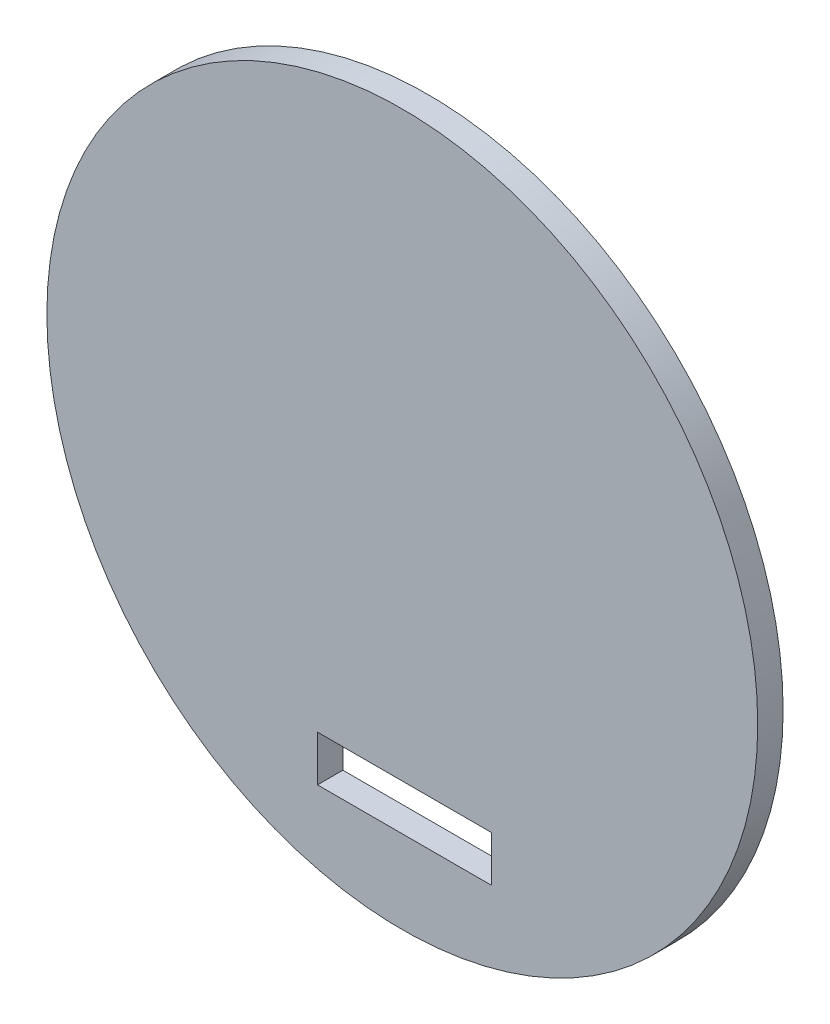
ISO-10303-21;
HEADER;
FILE_DESCRIPTION(('STEP AP214'),'2;1');
FILE_NAME('part.step','',(''),(''),'','','');
FILE_SCHEMA(('AUTOMOTIVE_DESIGN { 1 0 10303 214 1 1 1 1 }'));
ENDSEC;
DATA;
#1=APPLICATION_CONTEXT('core data for automotive mechanical design processes');
#2=APPLICATION_PROTOCOL_DEFINITION('international standard','automotive_design',2000,#1);
#3=PRODUCT_CONTEXT('',#1,'mechanical');
#4=PRODUCT('Part','Part','',(#3));
#5=PRODUCT_RELATED_PRODUCT_CATEGORY('part','',(#4));
#6=PRODUCT_DEFINITION_FORMATION('','',#4);
#7=PRODUCT_DEFINITION_CONTEXT('part definition',#1,'design');
#8=PRODUCT_DEFINITION('design','',#6,#7);
#9=PRODUCT_DEFINITION_SHAPE('','',#8);
#10=(LENGTH_UNIT() NAMED_UNIT(*) SI_UNIT(.MILLI.,.METRE.));
#11=(NAMED_UNIT(*) PLANE_ANGLE_UNIT() SI_UNIT($,.RADIAN.));
#12=(NAMED_UNIT(*) SI_UNIT($,.STERADIAN.) SOLID_ANGLE_UNIT());
#13=UNCERTAINTY_MEASURE_WITH_UNIT(LENGTH_MEASURE(1.E-05),#10,'distance_accuracy_value','');
#14=(GEOMETRIC_REPRESENTATION_CONTEXT(3) GLOBAL_UNCERTAINTY_ASSIGNED_CONTEXT((#13)) GLOBAL_UNIT_ASSIGNED_CONTEXT((#10,
#11,#12)) REPRESENTATION_CONTEXT('',''));
#15=CARTESIAN_POINT('',(0.,0.,0.));
#16=DIRECTION('',(0.,0.,1.));
#17=DIRECTION('',(1.,0.,0.));
#18=AXIS2_PLACEMENT_3D('',#15,#16,#17);
#19=CARTESIAN_POINT('',(0.,0.,1.));
#20=DIRECTION('',(0.,0.,1.));
#21=DIRECTION('',(1.,0.,0.));
#22=AXIS2_PLACEMENT_3D('',#19,#20,#21);
#23=PLANE('',#22);
#24=CARTESIAN_POINT('',(0.,0.,1.));
#25=DIRECTION('',(0.,0.,1.));
#26=DIRECTION('',(1.,0.,0.));
#27=AXIS2_PLACEMENT_3D('',#24,#25,#26);
#28=CIRCLE('',#27,14.);
#29=CARTESIAN_POINT('',(14.,0.,1.));
#30=VERTEX_POINT('',#29);
#31=EDGE_CURVE('E12',#30,#30,#28,.T.);
#32=ORIENTED_EDGE('',*,*,#31,.T.);
#33=EDGE_LOOP('',(#32));
#34=FACE_BOUND('',#33,.T.);
#35=DIRECTION('',(0.,-1.,0.));
#36=VECTOR('',#35,1.);
#37=CARTESIAN_POINT('',(3.50928581850868,-8.92789217330552,1.));
#38=LINE('',#37,#36);
#39=CARTESIAN_POINT('',(3.50928581850868,-8.92789217330552,1.));
#40=VERTEX_POINT('',#39);
#41=CARTESIAN_POINT('',(3.50928581850868,-10.7278921733055,1.));
#42=VERTEX_POINT('',#41);
#43=EDGE_CURVE('E97',#40,#42,#38,.T.);
#44=ORIENTED_EDGE('',*,*,#43,.T.);
#45=DIRECTION('',(1.,0.,0.));
#46=VECTOR('',#45,1.);
#47=CARTESIAN_POINT('',(-3.34071418149132,-10.7278921733055,1.));
#48=LINE('',#47,#46);
#49=CARTESIAN_POINT('',(-3.34071418149132,-10.7278921733055,1.));
#50=VERTEX_POINT('',#49);
#51=EDGE_CURVE('E88',#50,#42,#48,.T.);
#52=ORIENTED_EDGE('',*,*,#51,.F.);
#53=DIRECTION('',(0.,-1.,0.));
#54=VECTOR('',#53,1.);
#55=CARTESIAN_POINT('',(-3.34071418149132,-8.92789217330552,1.));
#56=LINE('',#55,#54);
#57=CARTESIAN_POINT('',(-3.34071418149132,-8.92789217330552,1.));
#58=VERTEX_POINT('',#57);
#59=EDGE_CURVE('E108',#58,#50,#56,.T.);
#60=ORIENTED_EDGE('',*,*,#59,.F.);
#61=DIRECTION('',(1.,0.,0.));
#62=VECTOR('',#61,1.);
#63=CARTESIAN_POINT('',(-3.34071418149132,-8.92789217330552,1.));
#64=LINE('',#63,#62);
#65=EDGE_CURVE('E63',#58,#40,#64,.T.);
#66=ORIENTED_EDGE('',*,*,#65,.T.);
#67=EDGE_LOOP('',(#44,#52,#60,#66));
#68=FACE_BOUND('',#67,.T.);
#69=ADVANCED_FACE('F48',(#34,#68),#23,.T.);
#70=CARTESIAN_POINT('',(0.,0.,0.));
#71=DIRECTION('',(0.,0.,1.));
#72=DIRECTION('',(1.,0.,0.));
#73=AXIS2_PLACEMENT_3D('',#70,#71,#72);
#74=PLANE('',#73);
#75=CARTESIAN_POINT('',(0.,0.,0.));
#76=DIRECTION('',(0.,0.,1.));
#77=DIRECTION('',(1.,0.,0.));
#78=AXIS2_PLACEMENT_3D('',#75,#76,#77);
#79=CIRCLE('',#78,14.);
#80=CARTESIAN_POINT('',(14.,0.,0.));
#81=VERTEX_POINT('',#80);
#82=EDGE_CURVE('E52',#81,#81,#79,.T.);
#83=ORIENTED_EDGE('',*,*,#82,.F.);
#84=EDGE_LOOP('',(#83));
#85=FACE_BOUND('',#84,.T.);
#86=DIRECTION('',(1.,0.,0.));
#87=VECTOR('',#86,1.);
#88=CARTESIAN_POINT('',(-3.34071418149132,-10.7278921733055,0.));
#89=LINE('',#88,#87);
#90=CARTESIAN_POINT('',(-3.34071418149132,-10.7278921733055,0.));
#91=VERTEX_POINT('',#90);
#92=CARTESIAN_POINT('',(3.50928581850868,-10.7278921733055,0.));
#93=VERTEX_POINT('',#92);
#94=EDGE_CURVE('E71',#91,#93,#89,.T.);
#95=ORIENTED_EDGE('',*,*,#94,.T.);
#96=DIRECTION('',(0.,-1.,0.));
#97=VECTOR('',#96,1.);
#98=CARTESIAN_POINT('',(3.50928581850868,-8.92789217330552,0.));
#99=LINE('',#98,#97);
#100=CARTESIAN_POINT('',(3.50928581850868,-8.92789217330552,0.));
#101=VERTEX_POINT('',#100);
#102=EDGE_CURVE('E104',#101,#93,#99,.T.);
#103=ORIENTED_EDGE('',*,*,#102,.F.);
#104=DIRECTION('',(1.,0.,0.));
#105=VECTOR('',#104,1.);
#106=CARTESIAN_POINT('',(-3.34071418149132,-8.92789217330552,0.));
#107=LINE('',#106,#105);
#108=CARTESIAN_POINT('',(-3.34071418149132,-8.92789217330552,0.));
#109=VERTEX_POINT('',#108);
#110=EDGE_CURVE('E114',#109,#101,#107,.T.);
#111=ORIENTED_EDGE('',*,*,#110,.F.);
#112=DIRECTION('',(0.,-1.,0.));
#113=VECTOR('',#112,1.);
#114=CARTESIAN_POINT('',(-3.34071418149132,-8.92789217330552,0.));
#115=LINE('',#114,#113);
#116=EDGE_CURVE('E98',#109,#91,#115,.T.);
#117=ORIENTED_EDGE('',*,*,#116,.T.);
#118=EDGE_LOOP('',(#95,#103,#111,#117));
#119=FACE_BOUND('',#118,.T.);
#120=ADVANCED_FACE('F126',(#85,#119),#74,.F.);
#121=CARTESIAN_POINT('',(0.,0.,1.));
#122=DIRECTION('',(0.,0.,-1.));
#123=DIRECTION('',(-1.,0.,0.));
#124=AXIS2_PLACEMENT_3D('',#121,#122,#123);
#125=CYLINDRICAL_SURFACE('',#124,14.);
#126=ORIENTED_EDGE('',*,*,#31,.F.);
#127=EDGE_LOOP('',(#126));
#128=FACE_BOUND('',#127,.T.);
#129=ORIENTED_EDGE('',*,*,#82,.T.);
#130=EDGE_LOOP('',(#129));
#131=FACE_BOUND('',#130,.T.);
#132=ADVANCED_FACE('F50',(#128,#131),#125,.T.);
#133=CARTESIAN_POINT('',(-3.34071418149132,-10.7278921733055,1.));
#134=DIRECTION('',(0.,1.,0.));
#135=DIRECTION('',(0.,0.,1.));
#136=AXIS2_PLACEMENT_3D('',#133,#134,#135);
#137=PLANE('',#136);
#138=ORIENTED_EDGE('',*,*,#94,.F.);
#139=DIRECTION('',(0.,0.,-1.));
#140=VECTOR('',#139,1.);
#141=CARTESIAN_POINT('',(-3.34071418149132,-10.7278921733055,1.));
#142=LINE('',#141,#140);
#143=EDGE_CURVE('E93',#50,#91,#142,.T.);
#144=ORIENTED_EDGE('',*,*,#143,.F.);
#145=ORIENTED_EDGE('',*,*,#51,.T.);
#146=DIRECTION('',(0.,0.,-1.));
#147=VECTOR('',#146,1.);
#148=CARTESIAN_POINT('',(3.50928581850868,-10.7278921733055,1.));
#149=LINE('',#148,#147);
#150=EDGE_CURVE('E91',#42,#93,#149,.T.);
#151=ORIENTED_EDGE('',*,*,#150,.T.);
#152=EDGE_LOOP('',(#138,#144,#145,#151));
#153=FACE_BOUND('',#152,.T.);
#154=ADVANCED_FACE('F90',(#153),#137,.T.);
#155=CARTESIAN_POINT('',(3.50928581850868,-8.92789217330552,1.));
#156=DIRECTION('',(1.,0.,0.));
#157=DIRECTION('',(0.,1.,0.));
#158=AXIS2_PLACEMENT_3D('',#155,#156,#157);
#159=PLANE('',#158);
#160=ORIENTED_EDGE('',*,*,#102,.T.);
#161=ORIENTED_EDGE('',*,*,#150,.F.);
#162=ORIENTED_EDGE('',*,*,#43,.F.);
#163=DIRECTION('',(0.,0.,-1.));
#164=VECTOR('',#163,1.);
#165=CARTESIAN_POINT('',(3.50928581850868,-8.92789217330552,1.));
#166=LINE('',#165,#164);
#167=EDGE_CURVE('E105',#40,#101,#166,.T.);
#168=ORIENTED_EDGE('',*,*,#167,.T.);
#169=EDGE_LOOP('',(#160,#161,#162,#168));
#170=FACE_BOUND('',#169,.T.);
#171=ADVANCED_FACE('F102',(#170),#159,.F.);
#172=CARTESIAN_POINT('',(-3.34071418149132,-8.92789217330552,1.));
#173=DIRECTION('',(0.,1.,0.));
#174=DIRECTION('',(0.,0.,1.));
#175=AXIS2_PLACEMENT_3D('',#172,#173,#174);
#176=PLANE('',#175);
#177=ORIENTED_EDGE('',*,*,#110,.T.);
#178=ORIENTED_EDGE('',*,*,#167,.F.);
#179=ORIENTED_EDGE('',*,*,#65,.F.);
#180=DIRECTION('',(0.,0.,-1.));
#181=VECTOR('',#180,1.);
#182=CARTESIAN_POINT('',(-3.34071418149132,-8.92789217330552,1.));
#183=LINE('',#182,#181);
#184=EDGE_CURVE('E120',#58,#109,#183,.T.);
#185=ORIENTED_EDGE('',*,*,#184,.T.);
#186=EDGE_LOOP('',(#177,#178,#179,#185));
#187=FACE_BOUND('',#186,.T.);
#188=ADVANCED_FACE('F123',(#187),#176,.F.);
#189=CARTESIAN_POINT('',(-3.34071418149132,-8.92789217330552,1.));
#190=DIRECTION('',(1.,0.,0.));
#191=DIRECTION('',(0.,0.,-1.));
#192=AXIS2_PLACEMENT_3D('',#189,#190,#191);
#193=PLANE('',#192);
#194=ORIENTED_EDGE('',*,*,#116,.F.);
#195=ORIENTED_EDGE('',*,*,#184,.F.);
#196=ORIENTED_EDGE('',*,*,#59,.T.);
#197=ORIENTED_EDGE('',*,*,#143,.T.);
#198=EDGE_LOOP('',(#194,#195,#196,#197));
#199=FACE_BOUND('',#198,.T.);
#200=ADVANCED_FACE('F128',(#199),#193,.T.);
#201=CLOSED_SHELL('',(#69,#120,#132,#154,#171,#188,#200));
#202=MANIFOLD_SOLID_BREP('B2',#201);
#203=ADVANCED_BREP_SHAPE_REPRESENTATION('',(#18,#202),#14);
#204=SHAPE_DEFINITION_REPRESENTATION(#9,#203);
ENDSEC;
END-ISO-10303-21;
